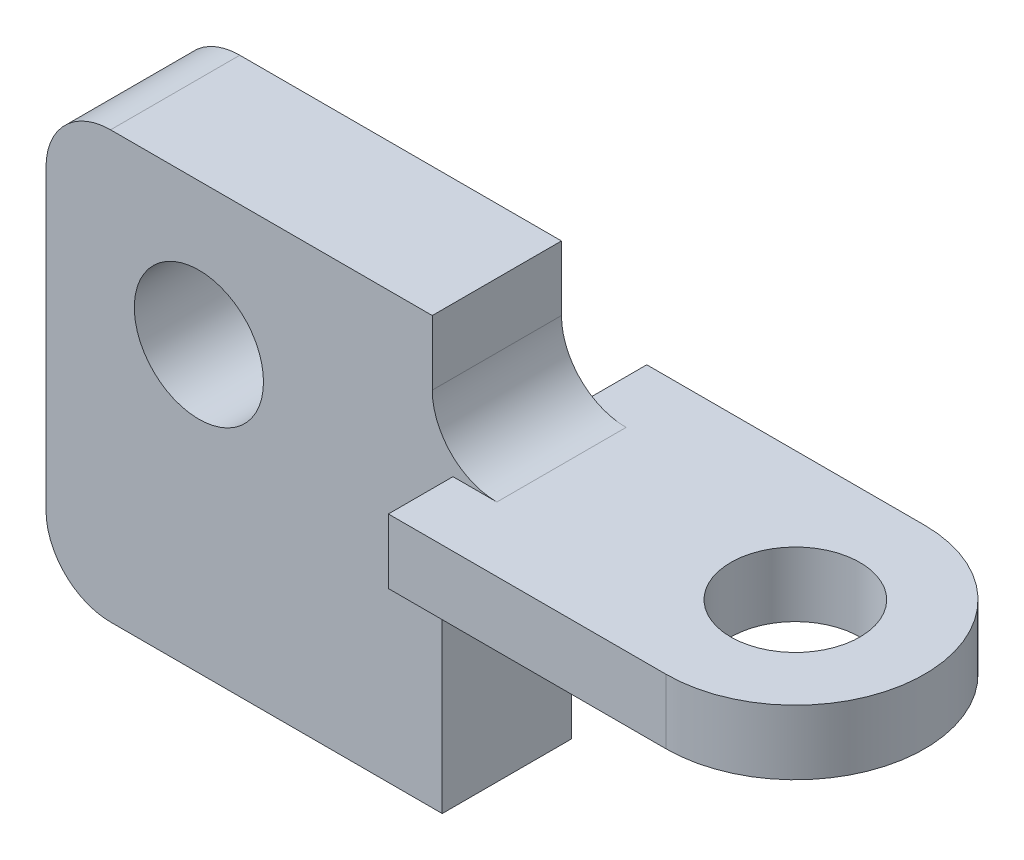
ISO-10303-21;
HEADER;
FILE_DESCRIPTION(('STEP AP214'),'2;1');
FILE_NAME('part.step','',(''),(''),'','','');
FILE_SCHEMA(('AUTOMOTIVE_DESIGN { 1 0 10303 214 1 1 1 1 }'));
ENDSEC;
DATA;
#1=APPLICATION_CONTEXT('core data for automotive mechanical design processes');
#2=APPLICATION_PROTOCOL_DEFINITION('international standard','automotive_design',2000,#1);
#3=PRODUCT_CONTEXT('',#1,'mechanical');
#4=PRODUCT('Part','Part','',(#3));
#5=PRODUCT_RELATED_PRODUCT_CATEGORY('part','',(#4));
#6=PRODUCT_DEFINITION_FORMATION('','',#4);
#7=PRODUCT_DEFINITION_CONTEXT('part definition',#1,'design');
#8=PRODUCT_DEFINITION('design','',#6,#7);
#9=PRODUCT_DEFINITION_SHAPE('','',#8);
#10=(LENGTH_UNIT() NAMED_UNIT(*) SI_UNIT(.MILLI.,.METRE.));
#11=(NAMED_UNIT(*) PLANE_ANGLE_UNIT() SI_UNIT($,.RADIAN.));
#12=(NAMED_UNIT(*) SI_UNIT($,.STERADIAN.) SOLID_ANGLE_UNIT());
#13=UNCERTAINTY_MEASURE_WITH_UNIT(LENGTH_MEASURE(1.E-05),#10,'distance_accuracy_value','');
#14=(GEOMETRIC_REPRESENTATION_CONTEXT(3) GLOBAL_UNCERTAINTY_ASSIGNED_CONTEXT((#13)) GLOBAL_UNIT_ASSIGNED_CONTEXT((#10,
#11,#12)) REPRESENTATION_CONTEXT('',''));
#15=CARTESIAN_POINT('',(0.,0.,0.));
#16=DIRECTION('',(0.,0.,1.));
#17=DIRECTION('',(1.,0.,0.));
#18=AXIS2_PLACEMENT_3D('',#15,#16,#17);
#19=CARTESIAN_POINT('',(0.,-914.4,0.));
#20=DIRECTION('',(1.,0.,0.));
#21=DIRECTION('',(0.,0.,-1.));
#22=AXIS2_PLACEMENT_3D('',#19,#20,#21);
#23=PLANE('',#22);
#24=DIRECTION('',(0.,1.,0.));
#25=VECTOR('',#24,1.);
#26=CARTESIAN_POINT('',(0.,-914.4,-254.));
#27=LINE('',#26,#25);
#28=CARTESIAN_POINT('',(0.,-660.4,-254.));
#29=VERTEX_POINT('',#28);
#30=CARTESIAN_POINT('',(0.,508.,-254.));
#31=VERTEX_POINT('',#30);
#32=EDGE_CURVE('E261',#29,#31,#27,.T.);
#33=ORIENTED_EDGE('',*,*,#32,.F.);
#34=DIRECTION('',(0.,0.,-1.));
#35=VECTOR('',#34,1.);
#36=CARTESIAN_POINT('',(0.,-660.4,0.));
#37=LINE('',#36,#35);
#38=CARTESIAN_POINT('',(0.,-660.4,254.));
#39=VERTEX_POINT('',#38);
#40=EDGE_CURVE('E41',#29,#39,#37,.F.);
#41=ORIENTED_EDGE('',*,*,#40,.T.);
#42=DIRECTION('',(0.,1.,0.));
#43=VECTOR('',#42,1.);
#44=CARTESIAN_POINT('',(0.,-914.4,254.));
#45=LINE('',#44,#43);
#46=CARTESIAN_POINT('',(0.,508.,254.));
#47=VERTEX_POINT('',#46);
#48=EDGE_CURVE('E260',#39,#47,#45,.T.);
#49=ORIENTED_EDGE('',*,*,#48,.T.);
#50=DIRECTION('',(0.,0.,-1.));
#51=VECTOR('',#50,1.);
#52=CARTESIAN_POINT('',(0.,508.,-254.));
#53=LINE('',#52,#51);
#54=EDGE_CURVE('E269',#47,#31,#53,.T.);
#55=ORIENTED_EDGE('',*,*,#54,.T.);
#56=EDGE_LOOP('',(#33,#41,#49,#55));
#57=FACE_BOUND('',#56,.T.);
#58=ADVANCED_FACE('F33',(#57),#23,.F.);
#59=CARTESIAN_POINT('',(0.,-914.4,-254.));
#60=DIRECTION('',(0.,0.,1.));
#61=DIRECTION('',(1.,0.,0.));
#62=AXIS2_PLACEMENT_3D('',#59,#60,#61);
#63=PLANE('',#62);
#64=CARTESIAN_POINT('',(601.129209231714,204.050012336289,-254.));
#65=DIRECTION('',(0.,0.,1.));
#66=DIRECTION('',(1.,0.,0.));
#67=AXIS2_PLACEMENT_3D('',#64,#65,#66);
#68=CIRCLE('',#67,254.);
#69=CARTESIAN_POINT('',(855.129209231714,204.050012336289,-254.));
#70=VERTEX_POINT('',#69);
#71=EDGE_CURVE('E165',#70,#70,#68,.T.);
#72=ORIENTED_EDGE('',*,*,#71,.T.);
#73=EDGE_LOOP('',(#72));
#74=FACE_BOUND('',#73,.T.);
#75=DIRECTION('',(1.,0.,0.));
#76=VECTOR('',#75,1.);
#77=CARTESIAN_POINT('',(0.,-914.4,-254.));
#78=LINE('',#77,#76);
#79=CARTESIAN_POINT('',(254.,-914.4,-254.));
#80=VERTEX_POINT('',#79);
#81=CARTESIAN_POINT('',(1557.94858798961,-914.4,-254.));
#82=VERTEX_POINT('',#81);
#83=EDGE_CURVE('E258',#80,#82,#78,.T.);
#84=ORIENTED_EDGE('',*,*,#83,.F.);
#85=CARTESIAN_POINT('',(254.,-660.4,-254.));
#86=DIRECTION('',(0.,0.,1.));
#87=DIRECTION('',(1.,0.,0.));
#88=AXIS2_PLACEMENT_3D('',#85,#86,#87);
#89=CIRCLE('',#88,254.);
#90=EDGE_CURVE('E55',#80,#29,#89,.F.);
#91=ORIENTED_EDGE('',*,*,#90,.T.);
#92=ORIENTED_EDGE('',*,*,#32,.T.);
#93=CARTESIAN_POINT('',(254.,508.,-254.));
#94=DIRECTION('',(0.,0.,1.));
#95=DIRECTION('',(1.,0.,0.));
#96=AXIS2_PLACEMENT_3D('',#93,#94,#95);
#97=CIRCLE('',#96,254.);
#98=CARTESIAN_POINT('',(254.,762.,-254.));
#99=VERTEX_POINT('',#98);
#100=EDGE_CURVE('E272',#31,#99,#97,.F.);
#101=ORIENTED_EDGE('',*,*,#100,.T.);
#102=DIRECTION('',(1.,0.,0.));
#103=VECTOR('',#102,1.);
#104=CARTESIAN_POINT('',(0.,762.,-254.));
#105=LINE('',#104,#103);
#106=CARTESIAN_POINT('',(1518.80584269663,762.,-254.));
#107=VERTEX_POINT('',#106);
#108=EDGE_CURVE('E190',#99,#107,#105,.T.);
#109=ORIENTED_EDGE('',*,*,#108,.T.);
#110=DIRECTION('',(0.,-1.,0.));
#111=VECTOR('',#110,1.);
#112=CARTESIAN_POINT('',(1518.80584269663,-914.399999999999,-254.));
#113=LINE('',#112,#111);
#114=CARTESIAN_POINT('',(1518.80584269663,508.,-254.));
#115=VERTEX_POINT('',#114);
#116=EDGE_CURVE('E182',#107,#115,#113,.T.);
#117=ORIENTED_EDGE('',*,*,#116,.T.);
#118=CARTESIAN_POINT('',(1772.80584269663,508.,-254.));
#119=DIRECTION('',(0.,0.,1.));
#120=DIRECTION('',(1.,0.,0.));
#121=AXIS2_PLACEMENT_3D('',#118,#119,#120);
#122=CIRCLE('',#121,254.);
#123=CARTESIAN_POINT('',(1772.80584269663,254.,-254.));
#124=VERTEX_POINT('',#123);
#125=EDGE_CURVE('E185',#115,#124,#122,.T.);
#126=ORIENTED_EDGE('',*,*,#125,.T.);
#127=DIRECTION('',(1.,0.,0.));
#128=VECTOR('',#127,1.);
#129=CARTESIAN_POINT('',(0.,254.,-254.));
#130=LINE('',#129,#128);
#131=CARTESIAN_POINT('',(1600.2,254.,-254.));
#132=VERTEX_POINT('',#131);
#133=EDGE_CURVE('E206',#132,#124,#130,.T.);
#134=ORIENTED_EDGE('',*,*,#133,.F.);
#135=DIRECTION('',(0.,-1.,0.));
#136=VECTOR('',#135,1.);
#137=CARTESIAN_POINT('',(1600.2,254.,-254.));
#138=LINE('',#137,#136);
#139=CARTESIAN_POINT('',(1600.2,0.,-254.));
#140=VERTEX_POINT('',#139);
#141=EDGE_CURVE('E250',#132,#140,#138,.T.);
#142=ORIENTED_EDGE('',*,*,#141,.T.);
#143=DIRECTION('',(1.,0.,0.));
#144=VECTOR('',#143,1.);
#145=CARTESIAN_POINT('',(0.,0.,-254.));
#146=LINE('',#145,#144);
#147=CARTESIAN_POINT('',(1772.80584269663,0.,-254.));
#148=VERTEX_POINT('',#147);
#149=EDGE_CURVE('E232',#140,#148,#146,.T.);
#150=ORIENTED_EDGE('',*,*,#149,.T.);
#151=CARTESIAN_POINT('',(1772.80584269663,-214.85725470702,-254.));
#152=DIRECTION('',(0.,0.,1.));
#153=DIRECTION('',(1.,0.,0.));
#154=AXIS2_PLACEMENT_3D('',#151,#152,#153);
#155=CIRCLE('',#154,214.85725470702);
#156=CARTESIAN_POINT('',(1557.94858798961,-214.85725470702,-254.));
#157=VERTEX_POINT('',#156);
#158=EDGE_CURVE('E155',#148,#157,#155,.T.);
#159=ORIENTED_EDGE('',*,*,#158,.T.);
#160=DIRECTION('',(0.,-1.,0.));
#161=VECTOR('',#160,1.);
#162=CARTESIAN_POINT('',(1557.94858798961,-914.4,-254.));
#163=LINE('',#162,#161);
#164=EDGE_CURVE('E152',#157,#82,#163,.T.);
#165=ORIENTED_EDGE('',*,*,#164,.T.);
#166=EDGE_LOOP('',(#84,#91,#92,#101,#109,#117,#126,#134,#142,#150,#159,#165));
#167=FACE_BOUND('',#166,.T.);
#168=ADVANCED_FACE('F287',(#74,#167),#63,.F.);
#169=CARTESIAN_POINT('',(0.,-914.4,254.));
#170=DIRECTION('',(0.,0.,1.));
#171=DIRECTION('',(1.,0.,0.));
#172=AXIS2_PLACEMENT_3D('',#169,#170,#171);
#173=PLANE('',#172);
#174=CARTESIAN_POINT('',(601.129209231714,204.050012336289,254.));
#175=DIRECTION('',(0.,0.,1.));
#176=DIRECTION('',(1.,0.,0.));
#177=AXIS2_PLACEMENT_3D('',#174,#175,#176);
#178=CIRCLE('',#177,254.);
#179=CARTESIAN_POINT('',(855.129209231714,204.050012336289,254.));
#180=VERTEX_POINT('',#179);
#181=EDGE_CURVE('E518',#180,#180,#178,.T.);
#182=ORIENTED_EDGE('',*,*,#181,.F.);
#183=EDGE_LOOP('',(#182));
#184=FACE_BOUND('',#183,.T.);
#185=ORIENTED_EDGE('',*,*,#48,.F.);
#186=CARTESIAN_POINT('',(254.,-660.4,254.));
#187=DIRECTION('',(0.,0.,1.));
#188=DIRECTION('',(1.,0.,0.));
#189=AXIS2_PLACEMENT_3D('',#186,#187,#188);
#190=CIRCLE('',#189,254.);
#191=CARTESIAN_POINT('',(254.,-914.4,254.));
#192=VERTEX_POINT('',#191);
#193=EDGE_CURVE('E11',#39,#192,#190,.T.);
#194=ORIENTED_EDGE('',*,*,#193,.T.);
#195=DIRECTION('',(1.,0.,0.));
#196=VECTOR('',#195,1.);
#197=CARTESIAN_POINT('',(0.,-914.4,254.));
#198=LINE('',#197,#196);
#199=CARTESIAN_POINT('',(1557.94858798961,-914.4,254.));
#200=VERTEX_POINT('',#199);
#201=EDGE_CURVE('E169',#192,#200,#198,.T.);
#202=ORIENTED_EDGE('',*,*,#201,.T.);
#203=DIRECTION('',(0.,-1.,0.));
#204=VECTOR('',#203,1.);
#205=CARTESIAN_POINT('',(1557.94858798961,-214.85725470702,254.));
#206=LINE('',#205,#204);
#207=CARTESIAN_POINT('',(1557.94858798961,-214.85725470702,254.));
#208=VERTEX_POINT('',#207);
#209=EDGE_CURVE('E149',#208,#200,#206,.T.);
#210=ORIENTED_EDGE('',*,*,#209,.F.);
#211=CARTESIAN_POINT('',(1772.80584269663,-214.85725470702,254.));
#212=DIRECTION('',(0.,0.,1.));
#213=DIRECTION('',(1.,0.,0.));
#214=AXIS2_PLACEMENT_3D('',#211,#212,#213);
#215=CIRCLE('',#214,214.85725470702);
#216=CARTESIAN_POINT('',(1772.80584269663,0.,254.));
#217=VERTEX_POINT('',#216);
#218=EDGE_CURVE('E158',#217,#208,#215,.T.);
#219=ORIENTED_EDGE('',*,*,#218,.F.);
#220=DIRECTION('',(1.,0.,0.));
#221=VECTOR('',#220,1.);
#222=CARTESIAN_POINT('',(0.,0.,254.));
#223=LINE('',#222,#221);
#224=CARTESIAN_POINT('',(1600.2,0.,254.));
#225=VERTEX_POINT('',#224);
#226=EDGE_CURVE('E236',#225,#217,#223,.T.);
#227=ORIENTED_EDGE('',*,*,#226,.F.);
#228=DIRECTION('',(0.,-1.,0.));
#229=VECTOR('',#228,1.);
#230=CARTESIAN_POINT('',(1600.2,254.,254.));
#231=LINE('',#230,#229);
#232=CARTESIAN_POINT('',(1600.2,254.,254.));
#233=VERTEX_POINT('',#232);
#234=EDGE_CURVE('E247',#233,#225,#231,.T.);
#235=ORIENTED_EDGE('',*,*,#234,.F.);
#236=DIRECTION('',(1.,0.,0.));
#237=VECTOR('',#236,1.);
#238=CARTESIAN_POINT('',(0.,254.,254.));
#239=LINE('',#238,#237);
#240=CARTESIAN_POINT('',(1772.80584269663,254.,254.));
#241=VERTEX_POINT('',#240);
#242=EDGE_CURVE('E212',#233,#241,#239,.T.);
#243=ORIENTED_EDGE('',*,*,#242,.T.);
#244=CARTESIAN_POINT('',(1772.80584269663,508.,254.));
#245=DIRECTION('',(0.,0.,1.));
#246=DIRECTION('',(-1.,0.,0.));
#247=AXIS2_PLACEMENT_3D('',#244,#245,#246);
#248=CIRCLE('',#247,254.);
#249=CARTESIAN_POINT('',(1518.80584269663,508.,254.));
#250=VERTEX_POINT('',#249);
#251=EDGE_CURVE('E175',#250,#241,#248,.T.);
#252=ORIENTED_EDGE('',*,*,#251,.F.);
#253=DIRECTION('',(0.,-1.,0.));
#254=VECTOR('',#253,1.);
#255=CARTESIAN_POINT('',(1518.80584269663,508.,254.));
#256=LINE('',#255,#254);
#257=CARTESIAN_POINT('',(1518.80584269663,762.,254.));
#258=VERTEX_POINT('',#257);
#259=EDGE_CURVE('E177',#258,#250,#256,.T.);
#260=ORIENTED_EDGE('',*,*,#259,.F.);
#261=DIRECTION('',(1.,0.,0.));
#262=VECTOR('',#261,1.);
#263=CARTESIAN_POINT('',(0.,762.,254.));
#264=LINE('',#263,#262);
#265=CARTESIAN_POINT('',(254.,762.,254.));
#266=VERTEX_POINT('',#265);
#267=EDGE_CURVE('E188',#266,#258,#264,.T.);
#268=ORIENTED_EDGE('',*,*,#267,.F.);
#269=CARTESIAN_POINT('',(254.,508.,254.));
#270=DIRECTION('',(0.,0.,1.));
#271=DIRECTION('',(1.,0.,0.));
#272=AXIS2_PLACEMENT_3D('',#269,#270,#271);
#273=CIRCLE('',#272,254.);
#274=EDGE_CURVE('E276',#266,#47,#273,.T.);
#275=ORIENTED_EDGE('',*,*,#274,.T.);
#276=EDGE_LOOP('',(#185,#194,#202,#210,#219,#227,#235,#243,#252,#260,#268,#275));
#277=FACE_BOUND('',#276,.T.);
#278=ADVANCED_FACE('F167',(#184,#277),#173,.T.);
#279=CARTESIAN_POINT('',(0.,-914.4,0.));
#280=DIRECTION('',(0.,1.,0.));
#281=DIRECTION('',(0.,0.,1.));
#282=AXIS2_PLACEMENT_3D('',#279,#280,#281);
#283=PLANE('',#282);
#284=ORIENTED_EDGE('',*,*,#201,.F.);
#285=DIRECTION('',(0.,0.,-1.));
#286=VECTOR('',#285,1.);
#287=CARTESIAN_POINT('',(254.,-914.4,0.));
#288=LINE('',#287,#286);
#289=EDGE_CURVE('E279',#192,#80,#288,.T.);
#290=ORIENTED_EDGE('',*,*,#289,.T.);
#291=ORIENTED_EDGE('',*,*,#83,.T.);
#292=DIRECTION('',(0.,0.,1.));
#293=VECTOR('',#292,1.);
#294=CARTESIAN_POINT('',(1557.94858798961,-914.4,0.));
#295=LINE('',#294,#293);
#296=EDGE_CURVE('E267',#82,#200,#295,.T.);
#297=ORIENTED_EDGE('',*,*,#296,.T.);
#298=EDGE_LOOP('',(#284,#290,#291,#297));
#299=FACE_BOUND('',#298,.T.);
#300=ADVANCED_FACE('F284',(#299),#283,.F.);
#301=CARTESIAN_POINT('',(2692.4,254.,-1.11022302462516E-13));
#302=DIRECTION('',(0.,-1.,0.));
#303=DIRECTION('',(0.,0.,-1.));
#304=AXIS2_PLACEMENT_3D('',#301,#302,#303);
#305=CYLINDRICAL_SURFACE('',#304,508.);
#306=CARTESIAN_POINT('',(2692.4,0.,-1.11022302462516E-13));
#307=DIRECTION('',(0.,1.,0.));
#308=DIRECTION('',(0.,0.,1.));
#309=AXIS2_PLACEMENT_3D('',#306,#307,#308);
#310=CIRCLE('',#309,508.);
#311=CARTESIAN_POINT('',(2692.4,0.,-508.));
#312=VERTEX_POINT('',#311);
#313=CARTESIAN_POINT('',(2692.4,0.,508.));
#314=VERTEX_POINT('',#313);
#315=EDGE_CURVE('E223',#312,#314,#310,.F.);
#316=ORIENTED_EDGE('',*,*,#315,.F.);
#317=DIRECTION('',(0.,-1.,0.));
#318=VECTOR('',#317,1.);
#319=CARTESIAN_POINT('',(2692.4,254.,-508.));
#320=LINE('',#319,#318);
#321=CARTESIAN_POINT('',(2692.4,254.,-508.));
#322=VERTEX_POINT('',#321);
#323=EDGE_CURVE('E255',#322,#312,#320,.T.);
#324=ORIENTED_EDGE('',*,*,#323,.F.);
#325=CARTESIAN_POINT('',(2692.4,254.,-1.11022302462516E-13));
#326=DIRECTION('',(0.,1.,0.));
#327=DIRECTION('',(0.,0.,1.));
#328=AXIS2_PLACEMENT_3D('',#325,#326,#327);
#329=CIRCLE('',#328,508.);
#330=CARTESIAN_POINT('',(2692.4,254.,508.));
#331=VERTEX_POINT('',#330);
#332=EDGE_CURVE('E196',#322,#331,#329,.F.);
#333=ORIENTED_EDGE('',*,*,#332,.T.);
#334=DIRECTION('',(0.,-1.,0.));
#335=VECTOR('',#334,1.);
#336=CARTESIAN_POINT('',(2692.4,254.,508.));
#337=LINE('',#336,#335);
#338=EDGE_CURVE('E220',#331,#314,#337,.T.);
#339=ORIENTED_EDGE('',*,*,#338,.T.);
#340=EDGE_LOOP('',(#316,#324,#333,#339));
#341=FACE_BOUND('',#340,.T.);
#342=ADVANCED_FACE('F341',(#341),#305,.T.);
#343=CARTESIAN_POINT('',(0.,254.,-508.));
#344=DIRECTION('',(0.,0.,-1.));
#345=DIRECTION('',(-1.,0.,0.));
#346=AXIS2_PLACEMENT_3D('',#343,#344,#345);
#347=PLANE('',#346);
#348=DIRECTION('',(1.,0.,0.));
#349=VECTOR('',#348,1.);
#350=CARTESIAN_POINT('',(0.,0.,-508.));
#351=LINE('',#350,#349);
#352=CARTESIAN_POINT('',(1600.2,0.,-508.));
#353=VERTEX_POINT('',#352);
#354=EDGE_CURVE('E226',#353,#312,#351,.T.);
#355=ORIENTED_EDGE('',*,*,#354,.F.);
#356=DIRECTION('',(0.,-1.,0.));
#357=VECTOR('',#356,1.);
#358=CARTESIAN_POINT('',(1600.2,254.,-508.));
#359=LINE('',#358,#357);
#360=CARTESIAN_POINT('',(1600.2,254.,-508.));
#361=VERTEX_POINT('',#360);
#362=EDGE_CURVE('E253',#361,#353,#359,.T.);
#363=ORIENTED_EDGE('',*,*,#362,.F.);
#364=DIRECTION('',(1.,0.,0.));
#365=VECTOR('',#364,1.);
#366=CARTESIAN_POINT('',(0.,254.,-508.));
#367=LINE('',#366,#365);
#368=EDGE_CURVE('E200',#361,#322,#367,.T.);
#369=ORIENTED_EDGE('',*,*,#368,.T.);
#370=ORIENTED_EDGE('',*,*,#323,.T.);
#371=EDGE_LOOP('',(#355,#363,#369,#370));
#372=FACE_BOUND('',#371,.T.);
#373=ADVANCED_FACE('F349',(#372),#347,.T.);
#374=CARTESIAN_POINT('',(1600.2,254.,0.));
#375=DIRECTION('',(-1.,0.,0.));
#376=DIRECTION('',(0.,0.,1.));
#377=AXIS2_PLACEMENT_3D('',#374,#375,#376);
#378=PLANE('',#377);
#379=DIRECTION('',(0.,0.,-1.));
#380=VECTOR('',#379,1.);
#381=CARTESIAN_POINT('',(1600.2,0.,0.));
#382=LINE('',#381,#380);
#383=EDGE_CURVE('E229',#140,#353,#382,.T.);
#384=ORIENTED_EDGE('',*,*,#383,.F.);
#385=ORIENTED_EDGE('',*,*,#141,.F.);
#386=DIRECTION('',(0.,0.,-1.));
#387=VECTOR('',#386,1.);
#388=CARTESIAN_POINT('',(1600.2,254.,0.));
#389=LINE('',#388,#387);
#390=EDGE_CURVE('E203',#132,#361,#389,.T.);
#391=ORIENTED_EDGE('',*,*,#390,.T.);
#392=ORIENTED_EDGE('',*,*,#362,.T.);
#393=EDGE_LOOP('',(#384,#385,#391,#392));
#394=FACE_BOUND('',#393,.T.);
#395=ADVANCED_FACE('F353',(#394),#378,.T.);
#396=CARTESIAN_POINT('',(1600.2,254.,0.));
#397=DIRECTION('',(1.,0.,0.));
#398=DIRECTION('',(0.,0.,-1.));
#399=AXIS2_PLACEMENT_3D('',#396,#397,#398);
#400=PLANE('',#399);
#401=DIRECTION('',(0.,0.,1.));
#402=VECTOR('',#401,1.);
#403=CARTESIAN_POINT('',(1600.2,0.,0.));
#404=LINE('',#403,#402);
#405=CARTESIAN_POINT('',(1600.2,0.,508.));
#406=VERTEX_POINT('',#405);
#407=EDGE_CURVE('E238',#225,#406,#404,.T.);
#408=ORIENTED_EDGE('',*,*,#407,.T.);
#409=DIRECTION('',(0.,-1.,0.));
#410=VECTOR('',#409,1.);
#411=CARTESIAN_POINT('',(1600.2,254.,508.));
#412=LINE('',#411,#410);
#413=CARTESIAN_POINT('',(1600.2,254.,508.));
#414=VERTEX_POINT('',#413);
#415=EDGE_CURVE('E244',#414,#406,#412,.T.);
#416=ORIENTED_EDGE('',*,*,#415,.F.);
#417=DIRECTION('',(0.,0.,1.));
#418=VECTOR('',#417,1.);
#419=CARTESIAN_POINT('',(1600.2,254.,0.));
#420=LINE('',#419,#418);
#421=EDGE_CURVE('E215',#233,#414,#420,.T.);
#422=ORIENTED_EDGE('',*,*,#421,.F.);
#423=ORIENTED_EDGE('',*,*,#234,.T.);
#424=EDGE_LOOP('',(#408,#416,#422,#423));
#425=FACE_BOUND('',#424,.T.);
#426=ADVANCED_FACE('F295',(#425),#400,.F.);
#427=CARTESIAN_POINT('',(2692.4,254.,-1.11022302462516E-13));
#428=DIRECTION('',(0.,-1.,0.));
#429=DIRECTION('',(0.,0.,-1.));
#430=AXIS2_PLACEMENT_3D('',#427,#428,#429);
#431=CYLINDRICAL_SURFACE('',#430,254.);
#432=CARTESIAN_POINT('',(2692.4,254.,-1.11022302462516E-13));
#433=DIRECTION('',(0.,1.,0.));
#434=DIRECTION('',(0.,0.,1.));
#435=AXIS2_PLACEMENT_3D('',#432,#433,#434);
#436=CIRCLE('',#435,254.);
#437=CARTESIAN_POINT('',(2692.4,254.,254.));
#438=VERTEX_POINT('',#437);
#439=EDGE_CURVE('E193',#438,#438,#436,.T.);
#440=ORIENTED_EDGE('',*,*,#439,.T.);
#441=EDGE_LOOP('',(#440));
#442=FACE_BOUND('',#441,.T.);
#443=CARTESIAN_POINT('',(2692.4,0.,-1.11022302462516E-13));
#444=DIRECTION('',(0.,1.,0.));
#445=DIRECTION('',(0.,0.,1.));
#446=AXIS2_PLACEMENT_3D('',#443,#444,#445);
#447=CIRCLE('',#446,254.);
#448=CARTESIAN_POINT('',(2692.4,0.,254.));
#449=VERTEX_POINT('',#448);
#450=EDGE_CURVE('E192',#449,#449,#447,.T.);
#451=ORIENTED_EDGE('',*,*,#450,.F.);
#452=EDGE_LOOP('',(#451));
#453=FACE_BOUND('',#452,.T.);
#454=ADVANCED_FACE('F342',(#442,#453),#431,.F.);
#455=CARTESIAN_POINT('',(0.,254.,508.));
#456=DIRECTION('',(0.,0.,-1.));
#457=DIRECTION('',(-1.,0.,0.));
#458=AXIS2_PLACEMENT_3D('',#455,#456,#457);
#459=PLANE('',#458);
#460=DIRECTION('',(1.,0.,0.));
#461=VECTOR('',#460,1.);
#462=CARTESIAN_POINT('',(0.,0.,508.));
#463=LINE('',#462,#461);
#464=EDGE_CURVE('E197',#406,#314,#463,.T.);
#465=ORIENTED_EDGE('',*,*,#464,.T.);
#466=ORIENTED_EDGE('',*,*,#338,.F.);
#467=DIRECTION('',(1.,0.,0.));
#468=VECTOR('',#467,1.);
#469=CARTESIAN_POINT('',(0.,254.,508.));
#470=LINE('',#469,#468);
#471=EDGE_CURVE('E218',#414,#331,#470,.T.);
#472=ORIENTED_EDGE('',*,*,#471,.F.);
#473=ORIENTED_EDGE('',*,*,#415,.T.);
#474=EDGE_LOOP('',(#465,#466,#472,#473));
#475=FACE_BOUND('',#474,.T.);
#476=ADVANCED_FACE('F345',(#475),#459,.F.);
#477=CARTESIAN_POINT('',(0.,254.,0.));
#478=DIRECTION('',(0.,1.,0.));
#479=DIRECTION('',(0.,0.,1.));
#480=AXIS2_PLACEMENT_3D('',#477,#478,#479);
#481=PLANE('',#480);
#482=ORIENTED_EDGE('',*,*,#439,.F.);
#483=EDGE_LOOP('',(#482));
#484=FACE_BOUND('',#483,.T.);
#485=ORIENTED_EDGE('',*,*,#332,.F.);
#486=ORIENTED_EDGE('',*,*,#368,.F.);
#487=ORIENTED_EDGE('',*,*,#390,.F.);
#488=ORIENTED_EDGE('',*,*,#133,.T.);
#489=DIRECTION('',(0.,0.,1.));
#490=VECTOR('',#489,1.);
#491=CARTESIAN_POINT('',(1772.80584269663,254.,0.));
#492=LINE('',#491,#490);
#493=EDGE_CURVE('E209',#124,#241,#492,.T.);
#494=ORIENTED_EDGE('',*,*,#493,.T.);
#495=ORIENTED_EDGE('',*,*,#242,.F.);
#496=ORIENTED_EDGE('',*,*,#421,.T.);
#497=ORIENTED_EDGE('',*,*,#471,.T.);
#498=EDGE_LOOP('',(#485,#486,#487,#488,#494,#495,#496,#497));
#499=FACE_BOUND('',#498,.T.);
#500=ADVANCED_FACE('F299',(#484,#499),#481,.T.);
#501=CARTESIAN_POINT('',(0.,0.,0.));
#502=DIRECTION('',(0.,1.,0.));
#503=DIRECTION('',(0.,0.,1.));
#504=AXIS2_PLACEMENT_3D('',#501,#502,#503);
#505=PLANE('',#504);
#506=ORIENTED_EDGE('',*,*,#450,.T.);
#507=EDGE_LOOP('',(#506));
#508=FACE_BOUND('',#507,.T.);
#509=ORIENTED_EDGE('',*,*,#315,.T.);
#510=ORIENTED_EDGE('',*,*,#464,.F.);
#511=ORIENTED_EDGE('',*,*,#407,.F.);
#512=ORIENTED_EDGE('',*,*,#226,.T.);
#513=DIRECTION('',(0.,0.,1.));
#514=VECTOR('',#513,1.);
#515=CARTESIAN_POINT('',(1772.80584269663,0.,0.));
#516=LINE('',#515,#514);
#517=EDGE_CURVE('E161',#148,#217,#516,.T.);
#518=ORIENTED_EDGE('',*,*,#517,.F.);
#519=ORIENTED_EDGE('',*,*,#149,.F.);
#520=ORIENTED_EDGE('',*,*,#383,.T.);
#521=ORIENTED_EDGE('',*,*,#354,.T.);
#522=EDGE_LOOP('',(#509,#510,#511,#512,#518,#519,#520,#521));
#523=FACE_BOUND('',#522,.T.);
#524=ADVANCED_FACE('F289',(#508,#523),#505,.F.);
#525=CARTESIAN_POINT('',(0.,762.,0.));
#526=DIRECTION('',(0.,1.,0.));
#527=DIRECTION('',(0.,0.,1.));
#528=AXIS2_PLACEMENT_3D('',#525,#526,#527);
#529=PLANE('',#528);
#530=ORIENTED_EDGE('',*,*,#108,.F.);
#531=DIRECTION('',(0.,0.,-1.));
#532=VECTOR('',#531,1.);
#533=CARTESIAN_POINT('',(254.,762.,254.));
#534=LINE('',#533,#532);
#535=EDGE_CURVE('E274',#99,#266,#534,.F.);
#536=ORIENTED_EDGE('',*,*,#535,.T.);
#537=ORIENTED_EDGE('',*,*,#267,.T.);
#538=DIRECTION('',(0.,0.,1.));
#539=VECTOR('',#538,1.);
#540=CARTESIAN_POINT('',(1518.80584269663,762.,0.));
#541=LINE('',#540,#539);
#542=EDGE_CURVE('E263',#107,#258,#541,.T.);
#543=ORIENTED_EDGE('',*,*,#542,.F.);
#544=EDGE_LOOP('',(#530,#536,#537,#543));
#545=FACE_BOUND('',#544,.T.);
#546=ADVANCED_FACE('F312',(#545),#529,.T.);
#547=CARTESIAN_POINT('',(1772.80584269663,508.,-354.260771289178));
#548=DIRECTION('',(0.,0.,1.));
#549=DIRECTION('',(1.,0.,0.));
#550=AXIS2_PLACEMENT_3D('',#547,#548,#549);
#551=CYLINDRICAL_SURFACE('',#550,254.);
#552=DIRECTION('',(0.,0.,1.));
#553=VECTOR('',#552,1.);
#554=CARTESIAN_POINT('',(1518.80584269663,508.,-354.260771289178));
#555=LINE('',#554,#553);
#556=EDGE_CURVE('E180',#115,#250,#555,.T.);
#557=ORIENTED_EDGE('',*,*,#556,.T.);
#558=ORIENTED_EDGE('',*,*,#251,.T.);
#559=ORIENTED_EDGE('',*,*,#493,.F.);
#560=ORIENTED_EDGE('',*,*,#125,.F.);
#561=EDGE_LOOP('',(#557,#558,#559,#560));
#562=FACE_BOUND('',#561,.T.);
#563=ADVANCED_FACE('F303',(#562),#551,.F.);
#564=CARTESIAN_POINT('',(1518.80584269663,508.,-354.260771289178));
#565=DIRECTION('',(-1.,0.,0.));
#566=DIRECTION('',(0.,-1.,0.));
#567=AXIS2_PLACEMENT_3D('',#564,#565,#566);
#568=PLANE('',#567);
#569=ORIENTED_EDGE('',*,*,#542,.T.);
#570=ORIENTED_EDGE('',*,*,#259,.T.);
#571=ORIENTED_EDGE('',*,*,#556,.F.);
#572=ORIENTED_EDGE('',*,*,#116,.F.);
#573=EDGE_LOOP('',(#569,#570,#571,#572));
#574=FACE_BOUND('',#573,.T.);
#575=ADVANCED_FACE('F309',(#574),#568,.F.);
#576=CARTESIAN_POINT('',(1557.94858798961,-214.85725470702,-354.260771289178));
#577=DIRECTION('',(-1.,0.,0.));
#578=DIRECTION('',(0.,-1.,0.));
#579=AXIS2_PLACEMENT_3D('',#576,#577,#578);
#580=PLANE('',#579);
#581=DIRECTION('',(0.,0.,1.));
#582=VECTOR('',#581,1.);
#583=CARTESIAN_POINT('',(1557.94858798961,-214.85725470702,-354.260771289178));
#584=LINE('',#583,#582);
#585=EDGE_CURVE('E144',#157,#208,#584,.T.);
#586=ORIENTED_EDGE('',*,*,#585,.T.);
#587=ORIENTED_EDGE('',*,*,#209,.T.);
#588=ORIENTED_EDGE('',*,*,#296,.F.);
#589=ORIENTED_EDGE('',*,*,#164,.F.);
#590=EDGE_LOOP('',(#586,#587,#588,#589));
#591=FACE_BOUND('',#590,.T.);
#592=ADVANCED_FACE('F146',(#591),#580,.F.);
#593=CARTESIAN_POINT('',(1772.80584269663,-214.85725470702,-354.260771289178));
#594=DIRECTION('',(0.,0.,1.));
#595=DIRECTION('',(1.,0.,0.));
#596=AXIS2_PLACEMENT_3D('',#593,#594,#595);
#597=CYLINDRICAL_SURFACE('',#596,214.85725470702);
#598=ORIENTED_EDGE('',*,*,#517,.T.);
#599=ORIENTED_EDGE('',*,*,#218,.T.);
#600=ORIENTED_EDGE('',*,*,#585,.F.);
#601=ORIENTED_EDGE('',*,*,#158,.F.);
#602=EDGE_LOOP('',(#598,#599,#600,#601));
#603=FACE_BOUND('',#602,.T.);
#604=ADVANCED_FACE('F159',(#603),#597,.F.);
#605=CARTESIAN_POINT('',(254.,508.,0.));
#606=DIRECTION('',(0.,0.,1.));
#607=DIRECTION('',(1.,0.,0.));
#608=AXIS2_PLACEMENT_3D('',#605,#606,#607);
#609=CYLINDRICAL_SURFACE('',#608,254.);
#610=ORIENTED_EDGE('',*,*,#274,.F.);
#611=ORIENTED_EDGE('',*,*,#535,.F.);
#612=ORIENTED_EDGE('',*,*,#100,.F.);
#613=ORIENTED_EDGE('',*,*,#54,.F.);
#614=EDGE_LOOP('',(#610,#611,#612,#613));
#615=FACE_BOUND('',#614,.T.);
#616=ADVANCED_FACE('F318',(#615),#609,.T.);
#617=CARTESIAN_POINT('',(254.,-660.4,0.));
#618=DIRECTION('',(0.,0.,-1.));
#619=DIRECTION('',(-1.,0.,0.));
#620=AXIS2_PLACEMENT_3D('',#617,#618,#619);
#621=CYLINDRICAL_SURFACE('',#620,254.);
#622=ORIENTED_EDGE('',*,*,#193,.F.);
#623=ORIENTED_EDGE('',*,*,#40,.F.);
#624=ORIENTED_EDGE('',*,*,#90,.F.);
#625=ORIENTED_EDGE('',*,*,#289,.F.);
#626=EDGE_LOOP('',(#622,#623,#624,#625));
#627=FACE_BOUND('',#626,.T.);
#628=ADVANCED_FACE('F35',(#627),#621,.T.);
#629=CARTESIAN_POINT('',(601.129209231714,204.050012336289,-360.679999999999));
#630=DIRECTION('',(0.,0.,1.));
#631=DIRECTION('',(1.,0.,0.));
#632=AXIS2_PLACEMENT_3D('',#629,#630,#631);
#633=CYLINDRICAL_SURFACE('',#632,254.);
#634=ORIENTED_EDGE('',*,*,#181,.T.);
#635=EDGE_LOOP('',(#634));
#636=FACE_BOUND('',#635,.T.);
#637=ORIENTED_EDGE('',*,*,#71,.F.);
#638=EDGE_LOOP('',(#637));
#639=FACE_BOUND('',#638,.T.);
#640=ADVANCED_FACE('F321',(#636,#639),#633,.F.);
#641=CLOSED_SHELL('',(#58,#168,#278,#300,#342,#373,#395,#426,#454,#476,#500,#524,#546,#563,#575,
#592,#604,#616,#628,#640));
#642=MANIFOLD_SOLID_BREP('B2',#641);
#643=ADVANCED_BREP_SHAPE_REPRESENTATION('',(#18,#642),#14);
#644=SHAPE_DEFINITION_REPRESENTATION(#9,#643);
ENDSEC;
END-ISO-10303-21;
